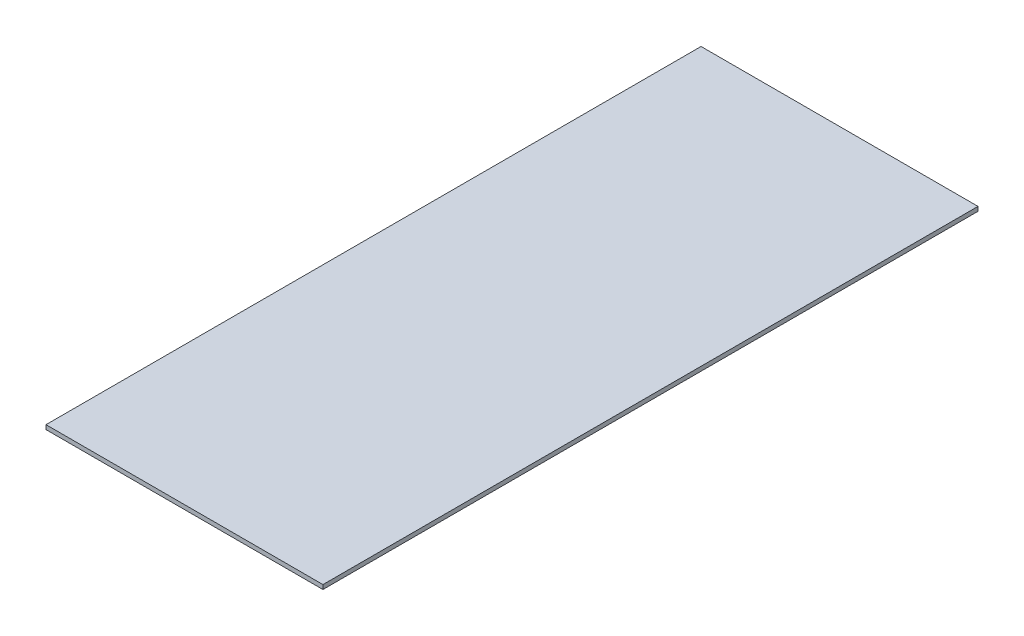
ISO-10303-21;
HEADER;
FILE_DESCRIPTION(('STEP AP214'),'2;1');
FILE_NAME('part.step','',(''),(''),'','','');
FILE_SCHEMA(('AUTOMOTIVE_DESIGN { 1 0 10303 214 1 1 1 1 }'));
ENDSEC;
DATA;
#1=APPLICATION_CONTEXT('core data for automotive mechanical design processes');
#2=APPLICATION_PROTOCOL_DEFINITION('international standard','automotive_design',2000,#1);
#3=PRODUCT_CONTEXT('',#1,'mechanical');
#4=PRODUCT('Part','Part','',(#3));
#5=PRODUCT_RELATED_PRODUCT_CATEGORY('part','',(#4));
#6=PRODUCT_DEFINITION_FORMATION('','',#4);
#7=PRODUCT_DEFINITION_CONTEXT('part definition',#1,'design');
#8=PRODUCT_DEFINITION('design','',#6,#7);
#9=PRODUCT_DEFINITION_SHAPE('','',#8);
#10=(LENGTH_UNIT() NAMED_UNIT(*) SI_UNIT(.MILLI.,.METRE.));
#11=(NAMED_UNIT(*) PLANE_ANGLE_UNIT() SI_UNIT($,.RADIAN.));
#12=(NAMED_UNIT(*) SI_UNIT($,.STERADIAN.) SOLID_ANGLE_UNIT());
#13=UNCERTAINTY_MEASURE_WITH_UNIT(LENGTH_MEASURE(1.E-05),#10,'distance_accuracy_value','');
#14=(GEOMETRIC_REPRESENTATION_CONTEXT(3) GLOBAL_UNCERTAINTY_ASSIGNED_CONTEXT((#13)) GLOBAL_UNIT_ASSIGNED_CONTEXT((#10,
#11,#12)) REPRESENTATION_CONTEXT('',''));
#15=CARTESIAN_POINT('',(0.,0.,0.));
#16=DIRECTION('',(0.,0.,1.));
#17=DIRECTION('',(1.,0.,0.));
#18=AXIS2_PLACEMENT_3D('',#15,#16,#17);
#19=CARTESIAN_POINT('',(96.65,3.,-228.6));
#20=DIRECTION('',(-1.,0.,0.));
#21=DIRECTION('',(0.,0.,1.));
#22=AXIS2_PLACEMENT_3D('',#19,#20,#21);
#23=PLANE('',#22);
#24=DIRECTION('',(0.,0.,-1.));
#25=VECTOR('',#24,1.);
#26=CARTESIAN_POINT('',(96.65,0.,-228.6));
#27=LINE('',#26,#25);
#28=CARTESIAN_POINT('',(96.65,0.,228.6));
#29=VERTEX_POINT('',#28);
#30=CARTESIAN_POINT('',(96.65,0.,-228.6));
#31=VERTEX_POINT('',#30);
#32=EDGE_CURVE('E97',#29,#31,#27,.T.);
#33=ORIENTED_EDGE('',*,*,#32,.T.);
#34=DIRECTION('',(0.,-1.,0.));
#35=VECTOR('',#34,1.);
#36=CARTESIAN_POINT('',(96.65,3.,-228.6));
#37=LINE('',#36,#35);
#38=CARTESIAN_POINT('',(96.65,3.,-228.6));
#39=VERTEX_POINT('',#38);
#40=EDGE_CURVE('E11',#39,#31,#37,.T.);
#41=ORIENTED_EDGE('',*,*,#40,.F.);
#42=DIRECTION('',(0.,0.,-1.));
#43=VECTOR('',#42,1.);
#44=CARTESIAN_POINT('',(96.65,3.,-228.6));
#45=LINE('',#44,#43);
#46=CARTESIAN_POINT('',(96.65,3.,228.6));
#47=VERTEX_POINT('',#46);
#48=EDGE_CURVE('E85',#47,#39,#45,.T.);
#49=ORIENTED_EDGE('',*,*,#48,.F.);
#50=DIRECTION('',(0.,-1.,0.));
#51=VECTOR('',#50,1.);
#52=CARTESIAN_POINT('',(96.65,3.,228.6));
#53=LINE('',#52,#51);
#54=EDGE_CURVE('E93',#47,#29,#53,.T.);
#55=ORIENTED_EDGE('',*,*,#54,.T.);
#56=EDGE_LOOP('',(#33,#41,#49,#55));
#57=FACE_BOUND('',#56,.T.);
#58=ADVANCED_FACE('F34',(#57),#23,.F.);
#59=CARTESIAN_POINT('',(-96.65,3.,-228.6));
#60=DIRECTION('',(0.,0.,1.));
#61=DIRECTION('',(1.,0.,0.));
#62=AXIS2_PLACEMENT_3D('',#59,#60,#61);
#63=PLANE('',#62);
#64=DIRECTION('',(-1.,0.,0.));
#65=VECTOR('',#64,1.);
#66=CARTESIAN_POINT('',(-96.65,0.,-228.6));
#67=LINE('',#66,#65);
#68=CARTESIAN_POINT('',(-96.65,0.,-228.6));
#69=VERTEX_POINT('',#68);
#70=EDGE_CURVE('E89',#31,#69,#67,.T.);
#71=ORIENTED_EDGE('',*,*,#70,.T.);
#72=DIRECTION('',(0.,-1.,0.));
#73=VECTOR('',#72,1.);
#74=CARTESIAN_POINT('',(-96.65,3.,-228.6));
#75=LINE('',#74,#73);
#76=CARTESIAN_POINT('',(-96.65,3.,-228.6));
#77=VERTEX_POINT('',#76);
#78=EDGE_CURVE('E42',#77,#69,#75,.T.);
#79=ORIENTED_EDGE('',*,*,#78,.F.);
#80=DIRECTION('',(-1.,0.,0.));
#81=VECTOR('',#80,1.);
#82=CARTESIAN_POINT('',(-96.65,3.,-228.6));
#83=LINE('',#82,#81);
#84=EDGE_CURVE('E80',#39,#77,#83,.T.);
#85=ORIENTED_EDGE('',*,*,#84,.F.);
#86=ORIENTED_EDGE('',*,*,#40,.T.);
#87=EDGE_LOOP('',(#71,#79,#85,#86));
#88=FACE_BOUND('',#87,.T.);
#89=ADVANCED_FACE('F88',(#88),#63,.F.);
#90=CARTESIAN_POINT('',(-96.65,3.,-228.6));
#91=DIRECTION('',(1.,0.,0.));
#92=DIRECTION('',(0.,0.,-1.));
#93=AXIS2_PLACEMENT_3D('',#90,#91,#92);
#94=PLANE('',#93);
#95=DIRECTION('',(0.,0.,1.));
#96=VECTOR('',#95,1.);
#97=CARTESIAN_POINT('',(-96.65,0.,-228.6));
#98=LINE('',#97,#96);
#99=CARTESIAN_POINT('',(-96.65,0.,228.6));
#100=VERTEX_POINT('',#99);
#101=EDGE_CURVE('E67',#69,#100,#98,.T.);
#102=ORIENTED_EDGE('',*,*,#101,.T.);
#103=DIRECTION('',(0.,-1.,0.));
#104=VECTOR('',#103,1.);
#105=CARTESIAN_POINT('',(-96.65,3.,228.6));
#106=LINE('',#105,#104);
#107=CARTESIAN_POINT('',(-96.65,3.,228.6));
#108=VERTEX_POINT('',#107);
#109=EDGE_CURVE('E90',#108,#100,#106,.T.);
#110=ORIENTED_EDGE('',*,*,#109,.F.);
#111=DIRECTION('',(0.,0.,1.));
#112=VECTOR('',#111,1.);
#113=CARTESIAN_POINT('',(-96.65,3.,-228.6));
#114=LINE('',#113,#112);
#115=EDGE_CURVE('E83',#77,#108,#114,.T.);
#116=ORIENTED_EDGE('',*,*,#115,.F.);
#117=ORIENTED_EDGE('',*,*,#78,.T.);
#118=EDGE_LOOP('',(#102,#110,#116,#117));
#119=FACE_BOUND('',#118,.T.);
#120=ADVANCED_FACE('F91',(#119),#94,.F.);
#121=CARTESIAN_POINT('',(-96.65,3.,228.6));
#122=DIRECTION('',(0.,0.,-1.));
#123=DIRECTION('',(-1.,0.,0.));
#124=AXIS2_PLACEMENT_3D('',#121,#122,#123);
#125=PLANE('',#124);
#126=DIRECTION('',(1.,0.,0.));
#127=VECTOR('',#126,1.);
#128=CARTESIAN_POINT('',(-96.65,0.,228.6));
#129=LINE('',#128,#127);
#130=EDGE_CURVE('E73',#100,#29,#129,.T.);
#131=ORIENTED_EDGE('',*,*,#130,.T.);
#132=ORIENTED_EDGE('',*,*,#54,.F.);
#133=DIRECTION('',(1.,0.,0.));
#134=VECTOR('',#133,1.);
#135=CARTESIAN_POINT('',(-96.65,3.,228.6));
#136=LINE('',#135,#134);
#137=EDGE_CURVE('E50',#108,#47,#136,.T.);
#138=ORIENTED_EDGE('',*,*,#137,.F.);
#139=ORIENTED_EDGE('',*,*,#109,.T.);
#140=EDGE_LOOP('',(#131,#132,#138,#139));
#141=FACE_BOUND('',#140,.T.);
#142=ADVANCED_FACE('F104',(#141),#125,.F.);
#143=CARTESIAN_POINT('',(0.,3.,0.));
#144=DIRECTION('',(0.,1.,0.));
#145=DIRECTION('',(0.,0.,1.));
#146=AXIS2_PLACEMENT_3D('',#143,#144,#145);
#147=PLANE('',#146);
#148=ORIENTED_EDGE('',*,*,#48,.T.);
#149=ORIENTED_EDGE('',*,*,#84,.T.);
#150=ORIENTED_EDGE('',*,*,#115,.T.);
#151=ORIENTED_EDGE('',*,*,#137,.T.);
#152=EDGE_LOOP('',(#148,#149,#150,#151));
#153=FACE_BOUND('',#152,.T.);
#154=ADVANCED_FACE('F81',(#153),#147,.T.);
#155=CARTESIAN_POINT('',(0.,0.,0.));
#156=DIRECTION('',(0.,1.,0.));
#157=DIRECTION('',(0.,0.,1.));
#158=AXIS2_PLACEMENT_3D('',#155,#156,#157);
#159=PLANE('',#158);
#160=ORIENTED_EDGE('',*,*,#32,.F.);
#161=ORIENTED_EDGE('',*,*,#130,.F.);
#162=ORIENTED_EDGE('',*,*,#101,.F.);
#163=ORIENTED_EDGE('',*,*,#70,.F.);
#164=EDGE_LOOP('',(#160,#161,#162,#163));
#165=FACE_BOUND('',#164,.T.);
#166=ADVANCED_FACE('F107',(#165),#159,.F.);
#167=CLOSED_SHELL('',(#58,#89,#120,#142,#154,#166));
#168=MANIFOLD_SOLID_BREP('B2',#167);
#169=ADVANCED_BREP_SHAPE_REPRESENTATION('',(#18,#168),#14);
#170=SHAPE_DEFINITION_REPRESENTATION(#9,#169);
ENDSEC;
END-ISO-10303-21;
